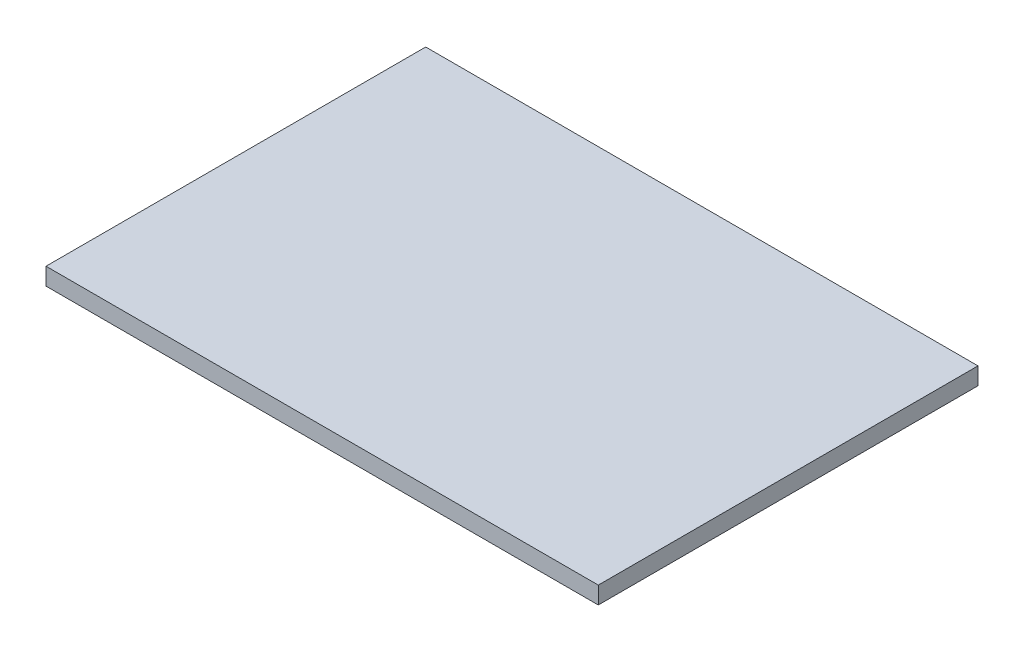
ISO-10303-21;
HEADER;
FILE_DESCRIPTION(('STEP AP214'),'2;1');
FILE_NAME('part.step','',(''),(''),'','','');
FILE_SCHEMA(('AUTOMOTIVE_DESIGN { 1 0 10303 214 1 1 1 1 }'));
ENDSEC;
DATA;
#1=APPLICATION_CONTEXT('core data for automotive mechanical design processes');
#2=APPLICATION_PROTOCOL_DEFINITION('international standard','automotive_design',2000,#1);
#3=PRODUCT_CONTEXT('',#1,'mechanical');
#4=PRODUCT('Part','Part','',(#3));
#5=PRODUCT_RELATED_PRODUCT_CATEGORY('part','',(#4));
#6=PRODUCT_DEFINITION_FORMATION('','',#4);
#7=PRODUCT_DEFINITION_CONTEXT('part definition',#1,'design');
#8=PRODUCT_DEFINITION('design','',#6,#7);
#9=PRODUCT_DEFINITION_SHAPE('','',#8);
#10=(LENGTH_UNIT() NAMED_UNIT(*) SI_UNIT(.MILLI.,.METRE.));
#11=(NAMED_UNIT(*) PLANE_ANGLE_UNIT() SI_UNIT($,.RADIAN.));
#12=(NAMED_UNIT(*) SI_UNIT($,.STERADIAN.) SOLID_ANGLE_UNIT());
#13=UNCERTAINTY_MEASURE_WITH_UNIT(LENGTH_MEASURE(1.E-05),#10,'distance_accuracy_value','');
#14=(GEOMETRIC_REPRESENTATION_CONTEXT(3) GLOBAL_UNCERTAINTY_ASSIGNED_CONTEXT((#13)) GLOBAL_UNIT_ASSIGNED_CONTEXT((#10,
#11,#12)) REPRESENTATION_CONTEXT('',''));
#15=CARTESIAN_POINT('',(0.,0.,0.));
#16=DIRECTION('',(0.,0.,1.));
#17=DIRECTION('',(1.,0.,0.));
#18=AXIS2_PLACEMENT_3D('',#15,#16,#17);
#19=CARTESIAN_POINT('',(127.,25.4,317.5));
#20=DIRECTION('',(-1.,0.,0.));
#21=DIRECTION('',(0.,0.,1.));
#22=AXIS2_PLACEMENT_3D('',#19,#20,#21);
#23=PLANE('',#22);
#24=DIRECTION('',(0.,0.,-1.));
#25=VECTOR('',#24,1.);
#26=CARTESIAN_POINT('',(127.,0.,317.5));
#27=LINE('',#26,#25);
#28=CARTESIAN_POINT('',(127.,0.,317.5));
#29=VERTEX_POINT('',#28);
#30=CARTESIAN_POINT('',(127.,0.,-241.3));
#31=VERTEX_POINT('',#30);
#32=EDGE_CURVE('E114',#29,#31,#27,.T.);
#33=ORIENTED_EDGE('',*,*,#32,.T.);
#34=DIRECTION('',(0.,-1.,0.));
#35=VECTOR('',#34,1.);
#36=CARTESIAN_POINT('',(127.,25.4,-241.3));
#37=LINE('',#36,#35);
#38=CARTESIAN_POINT('',(127.,25.4,-241.3));
#39=VERTEX_POINT('',#38);
#40=EDGE_CURVE('E11',#39,#31,#37,.T.);
#41=ORIENTED_EDGE('',*,*,#40,.F.);
#42=DIRECTION('',(0.,0.,-1.));
#43=VECTOR('',#42,1.);
#44=CARTESIAN_POINT('',(127.,25.4,317.5));
#45=LINE('',#44,#43);
#46=CARTESIAN_POINT('',(127.,25.4,317.5));
#47=VERTEX_POINT('',#46);
#48=EDGE_CURVE('E98',#47,#39,#45,.T.);
#49=ORIENTED_EDGE('',*,*,#48,.F.);
#50=DIRECTION('',(0.,-1.,0.));
#51=VECTOR('',#50,1.);
#52=CARTESIAN_POINT('',(127.,25.4,317.5));
#53=LINE('',#52,#51);
#54=EDGE_CURVE('E110',#47,#29,#53,.T.);
#55=ORIENTED_EDGE('',*,*,#54,.T.);
#56=EDGE_LOOP('',(#33,#41,#49,#55));
#57=FACE_BOUND('',#56,.T.);
#58=ADVANCED_FACE('F46',(#57),#23,.F.);
#59=CARTESIAN_POINT('',(-685.8,25.4,-241.3));
#60=DIRECTION('',(0.,0.,1.));
#61=DIRECTION('',(1.,0.,0.));
#62=AXIS2_PLACEMENT_3D('',#59,#60,#61);
#63=PLANE('',#62);
#64=DIRECTION('',(-1.,0.,0.));
#65=VECTOR('',#64,1.);
#66=CARTESIAN_POINT('',(-685.8,0.,-241.3));
#67=LINE('',#66,#65);
#68=CARTESIAN_POINT('',(-685.8,0.,-241.3));
#69=VERTEX_POINT('',#68);
#70=EDGE_CURVE('E103',#31,#69,#67,.T.);
#71=ORIENTED_EDGE('',*,*,#70,.T.);
#72=DIRECTION('',(0.,-1.,0.));
#73=VECTOR('',#72,1.);
#74=CARTESIAN_POINT('',(-685.8,25.4,-241.3));
#75=LINE('',#74,#73);
#76=CARTESIAN_POINT('',(-685.8,25.4,-241.3));
#77=VERTEX_POINT('',#76);
#78=EDGE_CURVE('E55',#77,#69,#75,.T.);
#79=ORIENTED_EDGE('',*,*,#78,.F.);
#80=DIRECTION('',(-1.,0.,0.));
#81=VECTOR('',#80,1.);
#82=CARTESIAN_POINT('',(-685.8,25.4,-241.3));
#83=LINE('',#82,#81);
#84=EDGE_CURVE('E93',#39,#77,#83,.T.);
#85=ORIENTED_EDGE('',*,*,#84,.F.);
#86=ORIENTED_EDGE('',*,*,#40,.T.);
#87=EDGE_LOOP('',(#71,#79,#85,#86));
#88=FACE_BOUND('',#87,.T.);
#89=ADVANCED_FACE('F102',(#88),#63,.F.);
#90=CARTESIAN_POINT('',(-685.8,25.4,317.5));
#91=DIRECTION('',(1.,0.,0.));
#92=DIRECTION('',(0.,0.,-1.));
#93=AXIS2_PLACEMENT_3D('',#90,#91,#92);
#94=PLANE('',#93);
#95=DIRECTION('',(0.,0.,1.));
#96=VECTOR('',#95,1.);
#97=CARTESIAN_POINT('',(-685.8,0.,317.5));
#98=LINE('',#97,#96);
#99=CARTESIAN_POINT('',(-685.8,0.,317.5));
#100=VERTEX_POINT('',#99);
#101=EDGE_CURVE('E80',#69,#100,#98,.T.);
#102=ORIENTED_EDGE('',*,*,#101,.T.);
#103=DIRECTION('',(0.,-1.,0.));
#104=VECTOR('',#103,1.);
#105=CARTESIAN_POINT('',(-685.8,25.4,317.5));
#106=LINE('',#105,#104);
#107=CARTESIAN_POINT('',(-685.8,25.4,317.5));
#108=VERTEX_POINT('',#107);
#109=EDGE_CURVE('E105',#108,#100,#106,.T.);
#110=ORIENTED_EDGE('',*,*,#109,.F.);
#111=DIRECTION('',(0.,0.,1.));
#112=VECTOR('',#111,1.);
#113=CARTESIAN_POINT('',(-685.8,25.4,317.5));
#114=LINE('',#113,#112);
#115=EDGE_CURVE('E96',#77,#108,#114,.T.);
#116=ORIENTED_EDGE('',*,*,#115,.F.);
#117=ORIENTED_EDGE('',*,*,#78,.T.);
#118=EDGE_LOOP('',(#102,#110,#116,#117));
#119=FACE_BOUND('',#118,.T.);
#120=ADVANCED_FACE('F106',(#119),#94,.F.);
#121=CARTESIAN_POINT('',(-685.8,25.4,317.5));
#122=DIRECTION('',(0.,0.,-1.));
#123=DIRECTION('',(-1.,0.,0.));
#124=AXIS2_PLACEMENT_3D('',#121,#122,#123);
#125=PLANE('',#124);
#126=DIRECTION('',(1.,0.,0.));
#127=VECTOR('',#126,1.);
#128=CARTESIAN_POINT('',(-685.8,0.,317.5));
#129=LINE('',#128,#127);
#130=EDGE_CURVE('E86',#100,#29,#129,.T.);
#131=ORIENTED_EDGE('',*,*,#130,.T.);
#132=ORIENTED_EDGE('',*,*,#54,.F.);
#133=DIRECTION('',(1.,0.,0.));
#134=VECTOR('',#133,1.);
#135=CARTESIAN_POINT('',(-685.8,25.4,317.5));
#136=LINE('',#135,#134);
#137=EDGE_CURVE('E63',#108,#47,#136,.T.);
#138=ORIENTED_EDGE('',*,*,#137,.F.);
#139=ORIENTED_EDGE('',*,*,#109,.T.);
#140=EDGE_LOOP('',(#131,#132,#138,#139));
#141=FACE_BOUND('',#140,.T.);
#142=ADVANCED_FACE('F127',(#141),#125,.F.);
#143=CARTESIAN_POINT('',(0.,25.4,0.));
#144=DIRECTION('',(0.,-1.,0.));
#145=DIRECTION('',(0.,0.,-1.));
#146=AXIS2_PLACEMENT_3D('',#143,#144,#145);
#147=PLANE('',#146);
#148=ORIENTED_EDGE('',*,*,#48,.T.);
#149=ORIENTED_EDGE('',*,*,#84,.T.);
#150=ORIENTED_EDGE('',*,*,#115,.T.);
#151=ORIENTED_EDGE('',*,*,#137,.T.);
#152=EDGE_LOOP('',(#148,#149,#150,#151));
#153=FACE_BOUND('',#152,.T.);
#154=ADVANCED_FACE('F94',(#153),#147,.F.);
#155=CARTESIAN_POINT('',(0.,0.,0.));
#156=DIRECTION('',(0.,-1.,0.));
#157=DIRECTION('',(0.,0.,-1.));
#158=AXIS2_PLACEMENT_3D('',#155,#156,#157);
#159=PLANE('',#158);
#160=ORIENTED_EDGE('',*,*,#32,.F.);
#161=ORIENTED_EDGE('',*,*,#130,.F.);
#162=ORIENTED_EDGE('',*,*,#101,.F.);
#163=ORIENTED_EDGE('',*,*,#70,.F.);
#164=EDGE_LOOP('',(#160,#161,#162,#163));
#165=FACE_BOUND('',#164,.T.);
#166=ADVANCED_FACE('F130',(#165),#159,.T.);
#167=CLOSED_SHELL('',(#58,#89,#120,#142,#154,#166));
#168=MANIFOLD_SOLID_BREP('B2',#167);
#169=ADVANCED_BREP_SHAPE_REPRESENTATION('',(#18,#168),#14);
#170=SHAPE_DEFINITION_REPRESENTATION(#9,#169);
ENDSEC;
END-ISO-10303-21;
